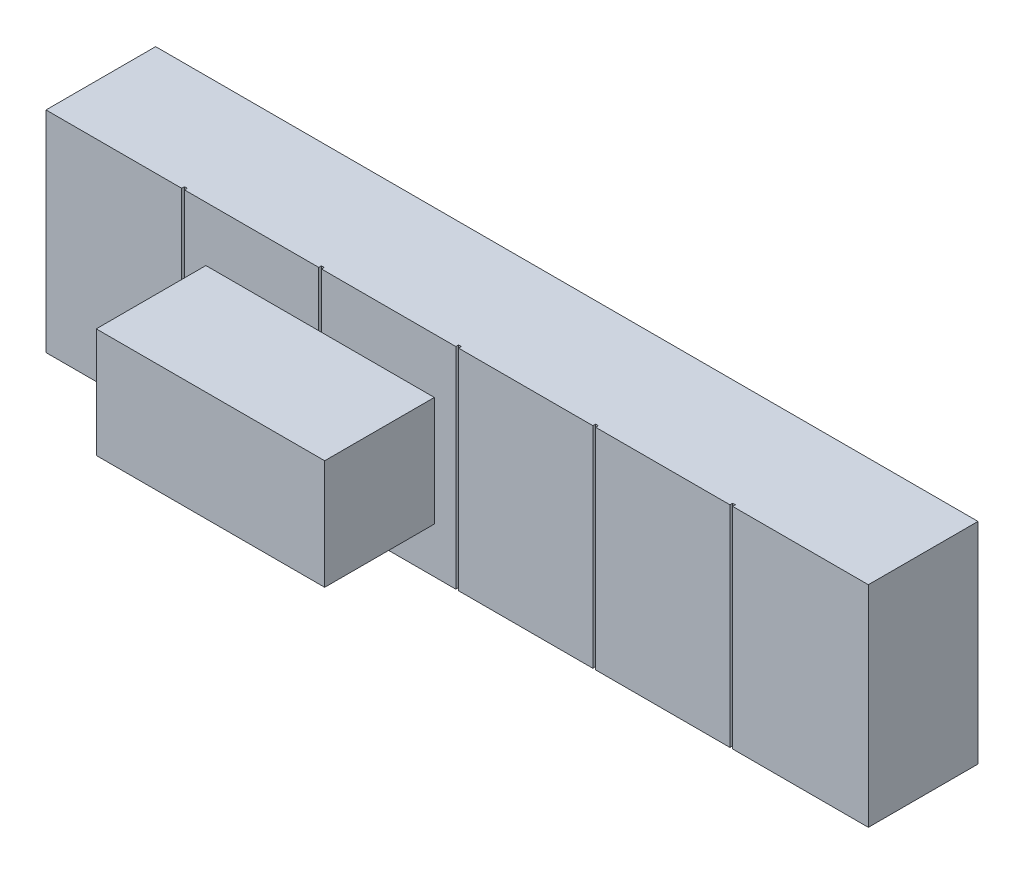
ISO-10303-21;
HEADER;
FILE_DESCRIPTION(('STEP AP214'),'2;1');
FILE_NAME('part.step','',(''),(''),'','','');
FILE_SCHEMA(('AUTOMOTIVE_DESIGN { 1 0 10303 214 1 1 1 1 }'));
ENDSEC;
DATA;
#1=APPLICATION_CONTEXT('core data for automotive mechanical design processes');
#2=APPLICATION_PROTOCOL_DEFINITION('international standard','automotive_design',2000,#1);
#3=PRODUCT_CONTEXT('',#1,'mechanical');
#4=PRODUCT('Part','Part','',(#3));
#5=PRODUCT_RELATED_PRODUCT_CATEGORY('part','',(#4));
#6=PRODUCT_DEFINITION_FORMATION('','',#4);
#7=PRODUCT_DEFINITION_CONTEXT('part definition',#1,'design');
#8=PRODUCT_DEFINITION('design','',#6,#7);
#9=PRODUCT_DEFINITION_SHAPE('','',#8);
#10=(LENGTH_UNIT() NAMED_UNIT(*) SI_UNIT(.MILLI.,.METRE.));
#11=(NAMED_UNIT(*) PLANE_ANGLE_UNIT() SI_UNIT($,.RADIAN.));
#12=(NAMED_UNIT(*) SI_UNIT($,.STERADIAN.) SOLID_ANGLE_UNIT());
#13=UNCERTAINTY_MEASURE_WITH_UNIT(LENGTH_MEASURE(1.E-05),#10,'distance_accuracy_value','');
#14=(GEOMETRIC_REPRESENTATION_CONTEXT(3) GLOBAL_UNCERTAINTY_ASSIGNED_CONTEXT((#13)) GLOBAL_UNIT_ASSIGNED_CONTEXT((#10,
#11,#12)) REPRESENTATION_CONTEXT('',''));
#15=CARTESIAN_POINT('',(0.,0.,0.));
#16=DIRECTION('',(0.,0.,1.));
#17=DIRECTION('',(1.,0.,0.));
#18=AXIS2_PLACEMENT_3D('',#15,#16,#17);
#19=CARTESIAN_POINT('',(0.,0.,120.));
#20=DIRECTION('',(0.,0.,-1.));
#21=DIRECTION('',(-1.,0.,0.));
#22=AXIS2_PLACEMENT_3D('',#19,#20,#21);
#23=PLANE('',#22);
#24=DIRECTION('',(-1.,0.,0.));
#25=VECTOR('',#24,1.);
#26=CARTESIAN_POINT('',(-275.,55.,120.));
#27=LINE('',#26,#25);
#28=CARTESIAN_POINT('',(-25.0000000000001,55.,120.));
#29=VERTEX_POINT('',#28);
#30=CARTESIAN_POINT('',(-148.5,55.,120.));
#31=VERTEX_POINT('',#30);
#32=EDGE_CURVE('E48',#29,#31,#27,.T.);
#33=ORIENTED_EDGE('',*,*,#32,.F.);
#34=DIRECTION('',(0.,1.,0.));
#35=VECTOR('',#34,1.);
#36=CARTESIAN_POINT('',(-25.0000000000001,-65.,120.));
#37=LINE('',#36,#35);
#38=CARTESIAN_POINT('',(-25.0000000000001,-65.,120.));
#39=VERTEX_POINT('',#38);
#40=EDGE_CURVE('E254',#39,#29,#37,.T.);
#41=ORIENTED_EDGE('',*,*,#40,.F.);
#42=DIRECTION('',(1.,0.,0.));
#43=VECTOR('',#42,1.);
#44=CARTESIAN_POINT('',(-275.,-65.,120.));
#45=LINE('',#44,#43);
#46=CARTESIAN_POINT('',(-148.5,-65.,120.));
#47=VERTEX_POINT('',#46);
#48=EDGE_CURVE('E497',#47,#39,#45,.T.);
#49=ORIENTED_EDGE('',*,*,#48,.F.);
#50=DIRECTION('',(0.,1.,0.));
#51=VECTOR('',#50,1.);
#52=CARTESIAN_POINT('',(-148.5,115.,120.));
#53=LINE('',#52,#51);
#54=CARTESIAN_POINT('',(-148.5,-115.,120.));
#55=VERTEX_POINT('',#54);
#56=EDGE_CURVE('E268',#55,#47,#53,.T.);
#57=ORIENTED_EDGE('',*,*,#56,.F.);
#58=DIRECTION('',(1.,0.,0.));
#59=VECTOR('',#58,1.);
#60=CARTESIAN_POINT('',(-450.,-115.,120.));
#61=LINE('',#60,#59);
#62=CARTESIAN_POINT('',(-1.50000000000011,-115.,120.));
#63=VERTEX_POINT('',#62);
#64=EDGE_CURVE('E459',#55,#63,#61,.T.);
#65=ORIENTED_EDGE('',*,*,#64,.T.);
#66=DIRECTION('',(0.,-1.,0.));
#67=VECTOR('',#66,1.);
#68=CARTESIAN_POINT('',(-1.50000000000017,115.,120.));
#69=LINE('',#68,#67);
#70=CARTESIAN_POINT('',(-1.50000000000011,115.,120.));
#71=VERTEX_POINT('',#70);
#72=EDGE_CURVE('E308',#71,#63,#69,.T.);
#73=ORIENTED_EDGE('',*,*,#72,.F.);
#74=DIRECTION('',(-1.,0.,0.));
#75=VECTOR('',#74,1.);
#76=CARTESIAN_POINT('',(-450.,115.,120.));
#77=LINE('',#76,#75);
#78=CARTESIAN_POINT('',(-148.5,115.,120.));
#79=VERTEX_POINT('',#78);
#80=EDGE_CURVE('E541',#71,#79,#77,.T.);
#81=ORIENTED_EDGE('',*,*,#80,.T.);
#82=EDGE_CURVE('E280',#31,#79,#53,.T.);
#83=ORIENTED_EDGE('',*,*,#82,.F.);
#84=EDGE_LOOP('',(#33,#41,#49,#57,#65,#73,#81,#83));
#85=FACE_BOUND('',#84,.T.);
#86=ADVANCED_FACE('F33',(#85),#23,.F.);
#87=CARTESIAN_POINT('',(-151.5,55.,120.));
#88=VERTEX_POINT('',#87);
#89=CARTESIAN_POINT('',(-275.,55.,120.));
#90=VERTEX_POINT('',#89);
#91=EDGE_CURVE('E491',#88,#90,#27,.T.);
#92=ORIENTED_EDGE('',*,*,#91,.F.);
#93=DIRECTION('',(0.,-1.,0.));
#94=VECTOR('',#93,1.);
#95=CARTESIAN_POINT('',(-151.5,115.,120.));
#96=LINE('',#95,#94);
#97=CARTESIAN_POINT('',(-151.5,115.,120.));
#98=VERTEX_POINT('',#97);
#99=EDGE_CURVE('E277',#98,#88,#96,.T.);
#100=ORIENTED_EDGE('',*,*,#99,.F.);
#101=CARTESIAN_POINT('',(-298.5,115.,120.));
#102=VERTEX_POINT('',#101);
#103=EDGE_CURVE('E406',#98,#102,#77,.T.);
#104=ORIENTED_EDGE('',*,*,#103,.T.);
#105=DIRECTION('',(0.,1.,0.));
#106=VECTOR('',#105,1.);
#107=CARTESIAN_POINT('',(-298.5,115.,120.));
#108=LINE('',#107,#106);
#109=CARTESIAN_POINT('',(-298.5,-115.,120.));
#110=VERTEX_POINT('',#109);
#111=EDGE_CURVE('E373',#110,#102,#108,.T.);
#112=ORIENTED_EDGE('',*,*,#111,.F.);
#113=CARTESIAN_POINT('',(-151.5,-115.,120.));
#114=VERTEX_POINT('',#113);
#115=EDGE_CURVE('E413',#110,#114,#61,.T.);
#116=ORIENTED_EDGE('',*,*,#115,.T.);
#117=CARTESIAN_POINT('',(-151.5,-65.,120.));
#118=VERTEX_POINT('',#117);
#119=EDGE_CURVE('E282',#118,#114,#96,.T.);
#120=ORIENTED_EDGE('',*,*,#119,.F.);
#121=CARTESIAN_POINT('',(-275.,-65.,120.));
#122=VERTEX_POINT('',#121);
#123=EDGE_CURVE('E56',#122,#118,#45,.T.);
#124=ORIENTED_EDGE('',*,*,#123,.F.);
#125=DIRECTION('',(0.,-1.,0.));
#126=VECTOR('',#125,1.);
#127=CARTESIAN_POINT('',(-275.,-65.,120.));
#128=LINE('',#127,#126);
#129=EDGE_CURVE('E492',#90,#122,#128,.T.);
#130=ORIENTED_EDGE('',*,*,#129,.F.);
#131=EDGE_LOOP('',(#92,#100,#104,#112,#116,#120,#124,#130));
#132=FACE_BOUND('',#131,.T.);
#133=ADVANCED_FACE('F474',(#132),#23,.F.);
#134=CARTESIAN_POINT('',(148.5,115.,120.));
#135=VERTEX_POINT('',#134);
#136=CARTESIAN_POINT('',(1.49999999999983,115.,120.));
#137=VERTEX_POINT('',#136);
#138=EDGE_CURVE('E543',#135,#137,#77,.T.);
#139=ORIENTED_EDGE('',*,*,#138,.T.);
#140=DIRECTION('',(0.,1.,0.));
#141=VECTOR('',#140,1.);
#142=CARTESIAN_POINT('',(1.49999999999983,115.,120.));
#143=LINE('',#142,#141);
#144=CARTESIAN_POINT('',(1.49999999999983,-115.,120.));
#145=VERTEX_POINT('',#144);
#146=EDGE_CURVE('E299',#145,#137,#143,.T.);
#147=ORIENTED_EDGE('',*,*,#146,.F.);
#148=CARTESIAN_POINT('',(148.5,-115.,120.));
#149=VERTEX_POINT('',#148);
#150=EDGE_CURVE('E453',#145,#149,#61,.T.);
#151=ORIENTED_EDGE('',*,*,#150,.T.);
#152=DIRECTION('',(0.,-1.,0.));
#153=VECTOR('',#152,1.);
#154=CARTESIAN_POINT('',(148.5,115.,120.));
#155=LINE('',#154,#153);
#156=EDGE_CURVE('E334',#135,#149,#155,.T.);
#157=ORIENTED_EDGE('',*,*,#156,.F.);
#158=EDGE_LOOP('',(#139,#147,#151,#157));
#159=FACE_BOUND('',#158,.T.);
#160=ADVANCED_FACE('F523',(#159),#23,.F.);
#161=CARTESIAN_POINT('',(298.5,115.,120.));
#162=VERTEX_POINT('',#161);
#163=CARTESIAN_POINT('',(151.5,115.,120.));
#164=VERTEX_POINT('',#163);
#165=EDGE_CURVE('E405',#162,#164,#77,.T.);
#166=ORIENTED_EDGE('',*,*,#165,.T.);
#167=DIRECTION('',(0.,1.,0.));
#168=VECTOR('',#167,1.);
#169=CARTESIAN_POINT('',(151.5,115.,120.));
#170=LINE('',#169,#168);
#171=CARTESIAN_POINT('',(151.5,-115.,120.));
#172=VERTEX_POINT('',#171);
#173=EDGE_CURVE('E325',#172,#164,#170,.T.);
#174=ORIENTED_EDGE('',*,*,#173,.F.);
#175=CARTESIAN_POINT('',(298.5,-115.,120.));
#176=VERTEX_POINT('',#175);
#177=EDGE_CURVE('E451',#172,#176,#61,.T.);
#178=ORIENTED_EDGE('',*,*,#177,.T.);
#179=DIRECTION('',(0.,-1.,0.));
#180=VECTOR('',#179,1.);
#181=CARTESIAN_POINT('',(298.5,115.,120.));
#182=LINE('',#181,#180);
#183=EDGE_CURVE('E258',#162,#176,#182,.T.);
#184=ORIENTED_EDGE('',*,*,#183,.F.);
#185=EDGE_LOOP('',(#166,#174,#178,#184));
#186=FACE_BOUND('',#185,.T.);
#187=ADVANCED_FACE('F533',(#186),#23,.F.);
#188=CARTESIAN_POINT('',(450.,115.,120.));
#189=VERTEX_POINT('',#188);
#190=CARTESIAN_POINT('',(301.5,115.,120.));
#191=VERTEX_POINT('',#190);
#192=EDGE_CURVE('E401',#189,#191,#77,.T.);
#193=ORIENTED_EDGE('',*,*,#192,.T.);
#194=DIRECTION('',(0.,1.,0.));
#195=VECTOR('',#194,1.);
#196=CARTESIAN_POINT('',(301.5,115.,120.));
#197=LINE('',#196,#195);
#198=CARTESIAN_POINT('',(301.5,-115.,120.));
#199=VERTEX_POINT('',#198);
#200=EDGE_CURVE('E350',#199,#191,#197,.T.);
#201=ORIENTED_EDGE('',*,*,#200,.F.);
#202=CARTESIAN_POINT('',(450.,-115.,120.));
#203=VERTEX_POINT('',#202);
#204=EDGE_CURVE('E408',#199,#203,#61,.T.);
#205=ORIENTED_EDGE('',*,*,#204,.T.);
#206=DIRECTION('',(0.,1.,0.));
#207=VECTOR('',#206,1.);
#208=CARTESIAN_POINT('',(450.,-115.,120.));
#209=LINE('',#208,#207);
#210=EDGE_CURVE('E396',#203,#189,#209,.T.);
#211=ORIENTED_EDGE('',*,*,#210,.T.);
#212=EDGE_LOOP('',(#193,#201,#205,#211));
#213=FACE_BOUND('',#212,.T.);
#214=ADVANCED_FACE('F448',(#213),#23,.F.);
#215=CARTESIAN_POINT('',(-450.,-115.,120.));
#216=VERTEX_POINT('',#215);
#217=CARTESIAN_POINT('',(-301.5,-115.,120.));
#218=VERTEX_POINT('',#217);
#219=EDGE_CURVE('E409',#216,#218,#61,.T.);
#220=ORIENTED_EDGE('',*,*,#219,.T.);
#221=DIRECTION('',(0.,-1.,0.));
#222=VECTOR('',#221,1.);
#223=CARTESIAN_POINT('',(-301.5,115.,120.));
#224=LINE('',#223,#222);
#225=CARTESIAN_POINT('',(-301.5,115.,120.));
#226=VERTEX_POINT('',#225);
#227=EDGE_CURVE('E288',#226,#218,#224,.T.);
#228=ORIENTED_EDGE('',*,*,#227,.F.);
#229=CARTESIAN_POINT('',(-450.,115.,120.));
#230=VERTEX_POINT('',#229);
#231=EDGE_CURVE('E399',#226,#230,#77,.T.);
#232=ORIENTED_EDGE('',*,*,#231,.T.);
#233=DIRECTION('',(0.,-1.,0.));
#234=VECTOR('',#233,1.);
#235=CARTESIAN_POINT('',(-450.,-115.,120.));
#236=LINE('',#235,#234);
#237=EDGE_CURVE('E404',#230,#216,#236,.T.);
#238=ORIENTED_EDGE('',*,*,#237,.T.);
#239=EDGE_LOOP('',(#220,#228,#232,#238));
#240=FACE_BOUND('',#239,.T.);
#241=ADVANCED_FACE('F518',(#240),#23,.F.);
#242=CARTESIAN_POINT('',(450.,-115.,120.));
#243=DIRECTION('',(-1.,0.,0.));
#244=DIRECTION('',(0.,0.,1.));
#245=AXIS2_PLACEMENT_3D('',#242,#243,#244);
#246=PLANE('',#245);
#247=DIRECTION('',(0.,1.,0.));
#248=VECTOR('',#247,1.);
#249=CARTESIAN_POINT('',(450.,-115.,0.));
#250=LINE('',#249,#248);
#251=CARTESIAN_POINT('',(450.,-115.,0.));
#252=VERTEX_POINT('',#251);
#253=CARTESIAN_POINT('',(450.,115.,0.));
#254=VERTEX_POINT('',#253);
#255=EDGE_CURVE('E388',#252,#254,#250,.T.);
#256=ORIENTED_EDGE('',*,*,#255,.T.);
#257=DIRECTION('',(0.,0.,-1.));
#258=VECTOR('',#257,1.);
#259=CARTESIAN_POINT('',(450.,115.,120.));
#260=LINE('',#259,#258);
#261=EDGE_CURVE('E11',#189,#254,#260,.T.);
#262=ORIENTED_EDGE('',*,*,#261,.F.);
#263=ORIENTED_EDGE('',*,*,#210,.F.);
#264=DIRECTION('',(0.,0.,-1.));
#265=VECTOR('',#264,1.);
#266=CARTESIAN_POINT('',(450.,-115.,120.));
#267=LINE('',#266,#265);
#268=EDGE_CURVE('E412',#203,#252,#267,.T.);
#269=ORIENTED_EDGE('',*,*,#268,.T.);
#270=EDGE_LOOP('',(#256,#262,#263,#269));
#271=FACE_BOUND('',#270,.T.);
#272=ADVANCED_FACE('F35',(#271),#246,.F.);
#273=CARTESIAN_POINT('',(-450.,115.,120.));
#274=DIRECTION('',(0.,-1.,0.));
#275=DIRECTION('',(0.,0.,-1.));
#276=AXIS2_PLACEMENT_3D('',#273,#274,#275);
#277=PLANE('',#276);
#278=DIRECTION('',(-1.,0.,0.));
#279=VECTOR('',#278,1.);
#280=CARTESIAN_POINT('',(-151.5,115.,117.));
#281=LINE('',#280,#279);
#282=CARTESIAN_POINT('',(-148.5,115.,117.));
#283=VERTEX_POINT('',#282);
#284=CARTESIAN_POINT('',(-151.5,115.,117.));
#285=VERTEX_POINT('',#284);
#286=EDGE_CURVE('E264',#283,#285,#281,.T.);
#287=ORIENTED_EDGE('',*,*,#286,.F.);
#288=DIRECTION('',(0.,0.,1.));
#289=VECTOR('',#288,1.);
#290=CARTESIAN_POINT('',(-148.5,115.,117.));
#291=LINE('',#290,#289);
#292=EDGE_CURVE('E285',#283,#79,#291,.T.);
#293=ORIENTED_EDGE('',*,*,#292,.T.);
#294=ORIENTED_EDGE('',*,*,#80,.F.);
#295=DIRECTION('',(0.,0.,1.));
#296=VECTOR('',#295,1.);
#297=CARTESIAN_POINT('',(-1.50000000000017,115.,117.));
#298=LINE('',#297,#296);
#299=CARTESIAN_POINT('',(-1.50000000000017,115.,117.));
#300=VERTEX_POINT('',#299);
#301=EDGE_CURVE('E307',#300,#71,#298,.T.);
#302=ORIENTED_EDGE('',*,*,#301,.F.);
#303=DIRECTION('',(-1.,0.,0.));
#304=VECTOR('',#303,1.);
#305=CARTESIAN_POINT('',(-1.50000000000017,115.,117.));
#306=LINE('',#305,#304);
#307=CARTESIAN_POINT('',(1.49999999999983,115.,117.));
#308=VERTEX_POINT('',#307);
#309=EDGE_CURVE('E295',#308,#300,#306,.T.);
#310=ORIENTED_EDGE('',*,*,#309,.F.);
#311=DIRECTION('',(0.,0.,1.));
#312=VECTOR('',#311,1.);
#313=CARTESIAN_POINT('',(1.49999999999983,115.,117.));
#314=LINE('',#313,#312);
#315=EDGE_CURVE('E312',#308,#137,#314,.T.);
#316=ORIENTED_EDGE('',*,*,#315,.T.);
#317=ORIENTED_EDGE('',*,*,#138,.F.);
#318=DIRECTION('',(0.,0.,1.));
#319=VECTOR('',#318,1.);
#320=CARTESIAN_POINT('',(148.5,115.,117.));
#321=LINE('',#320,#319);
#322=CARTESIAN_POINT('',(148.5,115.,117.));
#323=VERTEX_POINT('',#322);
#324=EDGE_CURVE('E333',#323,#135,#321,.T.);
#325=ORIENTED_EDGE('',*,*,#324,.F.);
#326=DIRECTION('',(-1.,0.,0.));
#327=VECTOR('',#326,1.);
#328=CARTESIAN_POINT('',(148.5,115.,117.));
#329=LINE('',#328,#327);
#330=CARTESIAN_POINT('',(151.5,115.,117.));
#331=VERTEX_POINT('',#330);
#332=EDGE_CURVE('E321',#331,#323,#329,.T.);
#333=ORIENTED_EDGE('',*,*,#332,.F.);
#334=DIRECTION('',(0.,0.,1.));
#335=VECTOR('',#334,1.);
#336=CARTESIAN_POINT('',(151.5,115.,117.));
#337=LINE('',#336,#335);
#338=EDGE_CURVE('E310',#331,#164,#337,.T.);
#339=ORIENTED_EDGE('',*,*,#338,.T.);
#340=ORIENTED_EDGE('',*,*,#165,.F.);
#341=DIRECTION('',(0.,0.,1.));
#342=VECTOR('',#341,1.);
#343=CARTESIAN_POINT('',(298.5,115.,117.));
#344=LINE('',#343,#342);
#345=CARTESIAN_POINT('',(298.5,115.,117.));
#346=VERTEX_POINT('',#345);
#347=EDGE_CURVE('E358',#346,#162,#344,.T.);
#348=ORIENTED_EDGE('',*,*,#347,.F.);
#349=DIRECTION('',(-1.,0.,0.));
#350=VECTOR('',#349,1.);
#351=CARTESIAN_POINT('',(298.5,115.,117.));
#352=LINE('',#351,#350);
#353=CARTESIAN_POINT('',(301.5,115.,117.));
#354=VERTEX_POINT('',#353);
#355=EDGE_CURVE('E346',#354,#346,#352,.T.);
#356=ORIENTED_EDGE('',*,*,#355,.F.);
#357=DIRECTION('',(0.,0.,1.));
#358=VECTOR('',#357,1.);
#359=CARTESIAN_POINT('',(301.5,115.,117.));
#360=LINE('',#359,#358);
#361=EDGE_CURVE('E336',#354,#191,#360,.T.);
#362=ORIENTED_EDGE('',*,*,#361,.T.);
#363=ORIENTED_EDGE('',*,*,#192,.F.);
#364=ORIENTED_EDGE('',*,*,#261,.T.);
#365=DIRECTION('',(-1.,0.,0.));
#366=VECTOR('',#365,1.);
#367=CARTESIAN_POINT('',(-450.,115.,0.));
#368=LINE('',#367,#366);
#369=CARTESIAN_POINT('',(-450.,115.,0.));
#370=VERTEX_POINT('',#369);
#371=EDGE_CURVE('E416',#254,#370,#368,.T.);
#372=ORIENTED_EDGE('',*,*,#371,.T.);
#373=DIRECTION('',(0.,0.,-1.));
#374=VECTOR('',#373,1.);
#375=CARTESIAN_POINT('',(-450.,115.,120.));
#376=LINE('',#375,#374);
#377=EDGE_CURVE('E41',#230,#370,#376,.T.);
#378=ORIENTED_EDGE('',*,*,#377,.F.);
#379=ORIENTED_EDGE('',*,*,#231,.F.);
#380=DIRECTION('',(0.,0.,1.));
#381=VECTOR('',#380,1.);
#382=CARTESIAN_POINT('',(-301.5,115.,117.));
#383=LINE('',#382,#381);
#384=CARTESIAN_POINT('',(-301.5,115.,117.));
#385=VERTEX_POINT('',#384);
#386=EDGE_CURVE('E386',#385,#226,#383,.T.);
#387=ORIENTED_EDGE('',*,*,#386,.F.);
#388=DIRECTION('',(-1.,0.,0.));
#389=VECTOR('',#388,1.);
#390=CARTESIAN_POINT('',(-301.5,115.,117.));
#391=LINE('',#390,#389);
#392=CARTESIAN_POINT('',(-298.5,115.,117.));
#393=VERTEX_POINT('',#392);
#394=EDGE_CURVE('E379',#393,#385,#391,.T.);
#395=ORIENTED_EDGE('',*,*,#394,.F.);
#396=DIRECTION('',(0.,0.,1.));
#397=VECTOR('',#396,1.);
#398=CARTESIAN_POINT('',(-298.5,115.,117.));
#399=LINE('',#398,#397);
#400=EDGE_CURVE('E389',#393,#102,#399,.T.);
#401=ORIENTED_EDGE('',*,*,#400,.T.);
#402=ORIENTED_EDGE('',*,*,#103,.F.);
#403=DIRECTION('',(0.,0.,1.));
#404=VECTOR('',#403,1.);
#405=CARTESIAN_POINT('',(-151.5,115.,117.));
#406=LINE('',#405,#404);
#407=EDGE_CURVE('E276',#285,#98,#406,.T.);
#408=ORIENTED_EDGE('',*,*,#407,.F.);
#409=EDGE_LOOP('',(#287,#293,#294,#302,#310,#316,#317,#325,#333,#339,#340,#348,#356,#362,#363,
#364,#372,#378,#379,#387,#395,#401,#402,#408));
#410=FACE_BOUND('',#409,.T.);
#411=ADVANCED_FACE('F488',(#410),#277,.F.);
#412=CARTESIAN_POINT('',(-450.,-115.,120.));
#413=DIRECTION('',(1.,0.,0.));
#414=DIRECTION('',(0.,0.,-1.));
#415=AXIS2_PLACEMENT_3D('',#412,#413,#414);
#416=PLANE('',#415);
#417=DIRECTION('',(0.,-1.,0.));
#418=VECTOR('',#417,1.);
#419=CARTESIAN_POINT('',(-450.,-115.,0.));
#420=LINE('',#419,#418);
#421=CARTESIAN_POINT('',(-450.,-115.,0.));
#422=VERTEX_POINT('',#421);
#423=EDGE_CURVE('E418',#370,#422,#420,.T.);
#424=ORIENTED_EDGE('',*,*,#423,.T.);
#425=DIRECTION('',(0.,0.,-1.));
#426=VECTOR('',#425,1.);
#427=CARTESIAN_POINT('',(-450.,-115.,120.));
#428=LINE('',#427,#426);
#429=EDGE_CURVE('E423',#216,#422,#428,.T.);
#430=ORIENTED_EDGE('',*,*,#429,.F.);
#431=ORIENTED_EDGE('',*,*,#237,.F.);
#432=ORIENTED_EDGE('',*,*,#377,.T.);
#433=EDGE_LOOP('',(#424,#430,#431,#432));
#434=FACE_BOUND('',#433,.T.);
#435=ADVANCED_FACE('F430',(#434),#416,.F.);
#436=CARTESIAN_POINT('',(-450.,-115.,120.));
#437=DIRECTION('',(0.,1.,0.));
#438=DIRECTION('',(0.,0.,1.));
#439=AXIS2_PLACEMENT_3D('',#436,#437,#438);
#440=PLANE('',#439);
#441=ORIENTED_EDGE('',*,*,#64,.F.);
#442=DIRECTION('',(0.,0.,1.));
#443=VECTOR('',#442,1.);
#444=CARTESIAN_POINT('',(-148.5,-115.,117.));
#445=LINE('',#444,#443);
#446=CARTESIAN_POINT('',(-148.5,-115.,117.));
#447=VERTEX_POINT('',#446);
#448=EDGE_CURVE('E289',#447,#55,#445,.T.);
#449=ORIENTED_EDGE('',*,*,#448,.F.);
#450=DIRECTION('',(1.,0.,0.));
#451=VECTOR('',#450,1.);
#452=CARTESIAN_POINT('',(-151.5,-115.,117.));
#453=LINE('',#452,#451);
#454=CARTESIAN_POINT('',(-151.5,-115.,117.));
#455=VERTEX_POINT('',#454);
#456=EDGE_CURVE('E271',#455,#447,#453,.T.);
#457=ORIENTED_EDGE('',*,*,#456,.F.);
#458=DIRECTION('',(0.,0.,1.));
#459=VECTOR('',#458,1.);
#460=CARTESIAN_POINT('',(-151.5,-115.,117.));
#461=LINE('',#460,#459);
#462=EDGE_CURVE('E291',#455,#114,#461,.T.);
#463=ORIENTED_EDGE('',*,*,#462,.T.);
#464=ORIENTED_EDGE('',*,*,#115,.F.);
#465=DIRECTION('',(0.,0.,1.));
#466=VECTOR('',#465,1.);
#467=CARTESIAN_POINT('',(-298.5,-115.,117.));
#468=LINE('',#467,#466);
#469=CARTESIAN_POINT('',(-298.5,-115.,117.));
#470=VERTEX_POINT('',#469);
#471=EDGE_CURVE('E392',#470,#110,#468,.T.);
#472=ORIENTED_EDGE('',*,*,#471,.F.);
#473=DIRECTION('',(1.,0.,0.));
#474=VECTOR('',#473,1.);
#475=CARTESIAN_POINT('',(-301.5,-115.,117.));
#476=LINE('',#475,#474);
#477=CARTESIAN_POINT('',(-301.5,-115.,117.));
#478=VERTEX_POINT('',#477);
#479=EDGE_CURVE('E372',#478,#470,#476,.T.);
#480=ORIENTED_EDGE('',*,*,#479,.F.);
#481=DIRECTION('',(0.,0.,1.));
#482=VECTOR('',#481,1.);
#483=CARTESIAN_POINT('',(-301.5,-115.,117.));
#484=LINE('',#483,#482);
#485=EDGE_CURVE('E382',#478,#218,#484,.T.);
#486=ORIENTED_EDGE('',*,*,#485,.T.);
#487=ORIENTED_EDGE('',*,*,#219,.F.);
#488=ORIENTED_EDGE('',*,*,#429,.T.);
#489=DIRECTION('',(1.,0.,0.));
#490=VECTOR('',#489,1.);
#491=CARTESIAN_POINT('',(-450.,-115.,0.));
#492=LINE('',#491,#490);
#493=EDGE_CURVE('E400',#422,#252,#492,.T.);
#494=ORIENTED_EDGE('',*,*,#493,.T.);
#495=ORIENTED_EDGE('',*,*,#268,.F.);
#496=ORIENTED_EDGE('',*,*,#204,.F.);
#497=DIRECTION('',(0.,0.,1.));
#498=VECTOR('',#497,1.);
#499=CARTESIAN_POINT('',(301.5,-115.,117.));
#500=LINE('',#499,#498);
#501=CARTESIAN_POINT('',(301.5,-115.,117.));
#502=VERTEX_POINT('',#501);
#503=EDGE_CURVE('E363',#502,#199,#500,.T.);
#504=ORIENTED_EDGE('',*,*,#503,.F.);
#505=DIRECTION('',(1.,0.,0.));
#506=VECTOR('',#505,1.);
#507=CARTESIAN_POINT('',(298.5,-115.,117.));
#508=LINE('',#507,#506);
#509=CARTESIAN_POINT('',(298.5,-115.,117.));
#510=VERTEX_POINT('',#509);
#511=EDGE_CURVE('E353',#510,#502,#508,.T.);
#512=ORIENTED_EDGE('',*,*,#511,.F.);
#513=DIRECTION('',(0.,0.,1.));
#514=VECTOR('',#513,1.);
#515=CARTESIAN_POINT('',(298.5,-115.,117.));
#516=LINE('',#515,#514);
#517=EDGE_CURVE('E365',#510,#176,#516,.T.);
#518=ORIENTED_EDGE('',*,*,#517,.T.);
#519=ORIENTED_EDGE('',*,*,#177,.F.);
#520=DIRECTION('',(0.,0.,1.));
#521=VECTOR('',#520,1.);
#522=CARTESIAN_POINT('',(151.5,-115.,117.));
#523=LINE('',#522,#521);
#524=CARTESIAN_POINT('',(151.5,-115.,117.));
#525=VERTEX_POINT('',#524);
#526=EDGE_CURVE('E340',#525,#172,#523,.T.);
#527=ORIENTED_EDGE('',*,*,#526,.F.);
#528=DIRECTION('',(1.,0.,0.));
#529=VECTOR('',#528,1.);
#530=CARTESIAN_POINT('',(148.5,-115.,117.));
#531=LINE('',#530,#529);
#532=CARTESIAN_POINT('',(148.5,-115.,117.));
#533=VERTEX_POINT('',#532);
#534=EDGE_CURVE('E328',#533,#525,#531,.T.);
#535=ORIENTED_EDGE('',*,*,#534,.F.);
#536=DIRECTION('',(0.,0.,1.));
#537=VECTOR('',#536,1.);
#538=CARTESIAN_POINT('',(148.5,-115.,117.));
#539=LINE('',#538,#537);
#540=EDGE_CURVE('E342',#533,#149,#539,.T.);
#541=ORIENTED_EDGE('',*,*,#540,.T.);
#542=ORIENTED_EDGE('',*,*,#150,.F.);
#543=DIRECTION('',(0.,0.,1.));
#544=VECTOR('',#543,1.);
#545=CARTESIAN_POINT('',(1.49999999999983,-115.,117.));
#546=LINE('',#545,#544);
#547=CARTESIAN_POINT('',(1.49999999999983,-115.,117.));
#548=VERTEX_POINT('',#547);
#549=EDGE_CURVE('E315',#548,#145,#546,.T.);
#550=ORIENTED_EDGE('',*,*,#549,.F.);
#551=DIRECTION('',(1.,0.,0.));
#552=VECTOR('',#551,1.);
#553=CARTESIAN_POINT('',(-1.50000000000011,-115.,117.));
#554=LINE('',#553,#552);
#555=CARTESIAN_POINT('',(-1.50000000000011,-115.,117.));
#556=VERTEX_POINT('',#555);
#557=EDGE_CURVE('E302',#556,#548,#554,.T.);
#558=ORIENTED_EDGE('',*,*,#557,.F.);
#559=DIRECTION('',(0.,0.,1.));
#560=VECTOR('',#559,1.);
#561=CARTESIAN_POINT('',(-1.50000000000011,-115.,117.));
#562=LINE('',#561,#560);
#563=EDGE_CURVE('E317',#556,#63,#562,.T.);
#564=ORIENTED_EDGE('',*,*,#563,.T.);
#565=EDGE_LOOP('',(#441,#449,#457,#463,#464,#472,#480,#486,#487,#488,#494,#495,#496,#504,#512,
#518,#519,#527,#535,#541,#542,#550,#558,#564));
#566=FACE_BOUND('',#565,.T.);
#567=ADVANCED_FACE('F441',(#566),#440,.F.);
#568=CARTESIAN_POINT('',(0.,0.,0.));
#569=DIRECTION('',(0.,0.,-1.));
#570=DIRECTION('',(-1.,0.,0.));
#571=AXIS2_PLACEMENT_3D('',#568,#569,#570);
#572=PLANE('',#571);
#573=ORIENTED_EDGE('',*,*,#255,.F.);
#574=ORIENTED_EDGE('',*,*,#493,.F.);
#575=ORIENTED_EDGE('',*,*,#423,.F.);
#576=ORIENTED_EDGE('',*,*,#371,.F.);
#577=EDGE_LOOP('',(#573,#574,#575,#576));
#578=FACE_BOUND('',#577,.T.);
#579=ADVANCED_FACE('F437',(#578),#572,.T.);
#580=CARTESIAN_POINT('',(-301.5,115.,117.));
#581=DIRECTION('',(-1.,0.,0.));
#582=DIRECTION('',(0.,-1.,0.));
#583=AXIS2_PLACEMENT_3D('',#580,#581,#582);
#584=PLANE('',#583);
#585=ORIENTED_EDGE('',*,*,#227,.T.);
#586=ORIENTED_EDGE('',*,*,#485,.F.);
#587=DIRECTION('',(0.,-1.,0.));
#588=VECTOR('',#587,1.);
#589=CARTESIAN_POINT('',(-301.5,115.,117.));
#590=LINE('',#589,#588);
#591=EDGE_CURVE('E369',#385,#478,#590,.T.);
#592=ORIENTED_EDGE('',*,*,#591,.F.);
#593=ORIENTED_EDGE('',*,*,#386,.T.);
#594=EDGE_LOOP('',(#585,#586,#592,#593));
#595=FACE_BOUND('',#594,.T.);
#596=ADVANCED_FACE('F536',(#595),#584,.F.);
#597=CARTESIAN_POINT('',(-298.5,115.,117.));
#598=DIRECTION('',(1.,0.,0.));
#599=DIRECTION('',(0.,0.,-1.));
#600=AXIS2_PLACEMENT_3D('',#597,#598,#599);
#601=PLANE('',#600);
#602=ORIENTED_EDGE('',*,*,#111,.T.);
#603=ORIENTED_EDGE('',*,*,#400,.F.);
#604=DIRECTION('',(0.,1.,0.));
#605=VECTOR('',#604,1.);
#606=CARTESIAN_POINT('',(-298.5,115.,117.));
#607=LINE('',#606,#605);
#608=EDGE_CURVE('E376',#470,#393,#607,.T.);
#609=ORIENTED_EDGE('',*,*,#608,.F.);
#610=ORIENTED_EDGE('',*,*,#471,.T.);
#611=EDGE_LOOP('',(#602,#603,#609,#610));
#612=FACE_BOUND('',#611,.T.);
#613=ADVANCED_FACE('F594',(#612),#601,.F.);
#614=CARTESIAN_POINT('',(0.,0.,117.));
#615=DIRECTION('',(0.,0.,1.));
#616=DIRECTION('',(1.,0.,0.));
#617=AXIS2_PLACEMENT_3D('',#614,#615,#616);
#618=PLANE('',#617);
#619=ORIENTED_EDGE('',*,*,#591,.T.);
#620=ORIENTED_EDGE('',*,*,#479,.T.);
#621=ORIENTED_EDGE('',*,*,#608,.T.);
#622=ORIENTED_EDGE('',*,*,#394,.T.);
#623=EDGE_LOOP('',(#619,#620,#621,#622));
#624=FACE_BOUND('',#623,.T.);
#625=ADVANCED_FACE('F538',(#624),#618,.T.);
#626=CARTESIAN_POINT('',(301.5,115.,117.));
#627=DIRECTION('',(1.,0.,0.));
#628=DIRECTION('',(0.,0.,-1.));
#629=AXIS2_PLACEMENT_3D('',#626,#627,#628);
#630=PLANE('',#629);
#631=ORIENTED_EDGE('',*,*,#200,.T.);
#632=ORIENTED_EDGE('',*,*,#361,.F.);
#633=DIRECTION('',(0.,1.,0.));
#634=VECTOR('',#633,1.);
#635=CARTESIAN_POINT('',(301.5,115.,117.));
#636=LINE('',#635,#634);
#637=EDGE_CURVE('E355',#502,#354,#636,.T.);
#638=ORIENTED_EDGE('',*,*,#637,.F.);
#639=ORIENTED_EDGE('',*,*,#503,.T.);
#640=EDGE_LOOP('',(#631,#632,#638,#639));
#641=FACE_BOUND('',#640,.T.);
#642=ADVANCED_FACE('F586',(#641),#630,.F.);
#643=CARTESIAN_POINT('',(298.5,115.,117.));
#644=DIRECTION('',(-1.,0.,0.));
#645=DIRECTION('',(0.,-1.,0.));
#646=AXIS2_PLACEMENT_3D('',#643,#644,#645);
#647=PLANE('',#646);
#648=ORIENTED_EDGE('',*,*,#183,.T.);
#649=ORIENTED_EDGE('',*,*,#517,.F.);
#650=DIRECTION('',(0.,-1.,0.));
#651=VECTOR('',#650,1.);
#652=CARTESIAN_POINT('',(298.5,115.,117.));
#653=LINE('',#652,#651);
#654=EDGE_CURVE('E349',#346,#510,#653,.T.);
#655=ORIENTED_EDGE('',*,*,#654,.F.);
#656=ORIENTED_EDGE('',*,*,#347,.T.);
#657=EDGE_LOOP('',(#648,#649,#655,#656));
#658=FACE_BOUND('',#657,.T.);
#659=ADVANCED_FACE('F580',(#658),#647,.F.);
#660=CARTESIAN_POINT('',(0.,0.,117.));
#661=DIRECTION('',(0.,0.,-1.));
#662=DIRECTION('',(-1.,0.,0.));
#663=AXIS2_PLACEMENT_3D('',#660,#661,#662);
#664=PLANE('',#663);
#665=ORIENTED_EDGE('',*,*,#355,.T.);
#666=ORIENTED_EDGE('',*,*,#654,.T.);
#667=ORIENTED_EDGE('',*,*,#511,.T.);
#668=ORIENTED_EDGE('',*,*,#637,.T.);
#669=EDGE_LOOP('',(#665,#666,#667,#668));
#670=FACE_BOUND('',#669,.T.);
#671=ADVANCED_FACE('F582',(#670),#664,.F.);
#672=CARTESIAN_POINT('',(151.5,115.,117.));
#673=DIRECTION('',(1.,0.,0.));
#674=DIRECTION('',(0.,0.,-1.));
#675=AXIS2_PLACEMENT_3D('',#672,#673,#674);
#676=PLANE('',#675);
#677=ORIENTED_EDGE('',*,*,#173,.T.);
#678=ORIENTED_EDGE('',*,*,#338,.F.);
#679=DIRECTION('',(0.,1.,0.));
#680=VECTOR('',#679,1.);
#681=CARTESIAN_POINT('',(151.5,115.,117.));
#682=LINE('',#681,#680);
#683=EDGE_CURVE('E330',#525,#331,#682,.T.);
#684=ORIENTED_EDGE('',*,*,#683,.F.);
#685=ORIENTED_EDGE('',*,*,#526,.T.);
#686=EDGE_LOOP('',(#677,#678,#684,#685));
#687=FACE_BOUND('',#686,.T.);
#688=ADVANCED_FACE('F577',(#687),#676,.F.);
#689=CARTESIAN_POINT('',(148.5,115.,117.));
#690=DIRECTION('',(-1.,0.,0.));
#691=DIRECTION('',(0.,-1.,0.));
#692=AXIS2_PLACEMENT_3D('',#689,#690,#691);
#693=PLANE('',#692);
#694=ORIENTED_EDGE('',*,*,#156,.T.);
#695=ORIENTED_EDGE('',*,*,#540,.F.);
#696=DIRECTION('',(0.,-1.,0.));
#697=VECTOR('',#696,1.);
#698=CARTESIAN_POINT('',(148.5,115.,117.));
#699=LINE('',#698,#697);
#700=EDGE_CURVE('E324',#323,#533,#699,.T.);
#701=ORIENTED_EDGE('',*,*,#700,.F.);
#702=ORIENTED_EDGE('',*,*,#324,.T.);
#703=EDGE_LOOP('',(#694,#695,#701,#702));
#704=FACE_BOUND('',#703,.T.);
#705=ADVANCED_FACE('F570',(#704),#693,.F.);
#706=CARTESIAN_POINT('',(0.,0.,117.));
#707=DIRECTION('',(0.,0.,-1.));
#708=DIRECTION('',(-1.,0.,0.));
#709=AXIS2_PLACEMENT_3D('',#706,#707,#708);
#710=PLANE('',#709);
#711=ORIENTED_EDGE('',*,*,#332,.T.);
#712=ORIENTED_EDGE('',*,*,#700,.T.);
#713=ORIENTED_EDGE('',*,*,#534,.T.);
#714=ORIENTED_EDGE('',*,*,#683,.T.);
#715=EDGE_LOOP('',(#711,#712,#713,#714));
#716=FACE_BOUND('',#715,.T.);
#717=ADVANCED_FACE('F572',(#716),#710,.F.);
#718=CARTESIAN_POINT('',(1.49999999999983,115.,117.));
#719=DIRECTION('',(1.,0.,0.));
#720=DIRECTION('',(0.,0.,-1.));
#721=AXIS2_PLACEMENT_3D('',#718,#719,#720);
#722=PLANE('',#721);
#723=ORIENTED_EDGE('',*,*,#146,.T.);
#724=ORIENTED_EDGE('',*,*,#315,.F.);
#725=DIRECTION('',(0.,1.,0.));
#726=VECTOR('',#725,1.);
#727=CARTESIAN_POINT('',(1.49999999999983,115.,117.));
#728=LINE('',#727,#726);
#729=EDGE_CURVE('E304',#548,#308,#728,.T.);
#730=ORIENTED_EDGE('',*,*,#729,.F.);
#731=ORIENTED_EDGE('',*,*,#549,.T.);
#732=EDGE_LOOP('',(#723,#724,#730,#731));
#733=FACE_BOUND('',#732,.T.);
#734=ADVANCED_FACE('F566',(#733),#722,.F.);
#735=CARTESIAN_POINT('',(-1.50000000000017,115.,117.));
#736=DIRECTION('',(-1.,0.,0.));
#737=DIRECTION('',(0.,-1.,0.));
#738=AXIS2_PLACEMENT_3D('',#735,#736,#737);
#739=PLANE('',#738);
#740=ORIENTED_EDGE('',*,*,#72,.T.);
#741=ORIENTED_EDGE('',*,*,#563,.F.);
#742=DIRECTION('',(0.,-1.,0.));
#743=VECTOR('',#742,1.);
#744=CARTESIAN_POINT('',(-1.50000000000017,115.,117.));
#745=LINE('',#744,#743);
#746=EDGE_CURVE('E298',#300,#556,#745,.T.);
#747=ORIENTED_EDGE('',*,*,#746,.F.);
#748=ORIENTED_EDGE('',*,*,#301,.T.);
#749=EDGE_LOOP('',(#740,#741,#747,#748));
#750=FACE_BOUND('',#749,.T.);
#751=ADVANCED_FACE('F560',(#750),#739,.F.);
#752=CARTESIAN_POINT('',(0.,0.,117.));
#753=DIRECTION('',(0.,0.,-1.));
#754=DIRECTION('',(-1.,0.,0.));
#755=AXIS2_PLACEMENT_3D('',#752,#753,#754);
#756=PLANE('',#755);
#757=ORIENTED_EDGE('',*,*,#309,.T.);
#758=ORIENTED_EDGE('',*,*,#746,.T.);
#759=ORIENTED_EDGE('',*,*,#557,.T.);
#760=ORIENTED_EDGE('',*,*,#729,.T.);
#761=EDGE_LOOP('',(#757,#758,#759,#760));
#762=FACE_BOUND('',#761,.T.);
#763=ADVANCED_FACE('F562',(#762),#756,.F.);
#764=CARTESIAN_POINT('',(-148.5,115.,117.));
#765=DIRECTION('',(1.,0.,0.));
#766=DIRECTION('',(0.,0.,-1.));
#767=AXIS2_PLACEMENT_3D('',#764,#765,#766);
#768=PLANE('',#767);
#769=ORIENTED_EDGE('',*,*,#56,.T.);
#770=DIRECTION('',(0.,1.,0.));
#771=VECTOR('',#770,1.);
#772=CARTESIAN_POINT('',(-148.5,115.,120.));
#773=LINE('',#772,#771);
#774=EDGE_CURVE('E255',#47,#31,#773,.T.);
#775=ORIENTED_EDGE('',*,*,#774,.T.);
#776=ORIENTED_EDGE('',*,*,#82,.T.);
#777=ORIENTED_EDGE('',*,*,#292,.F.);
#778=DIRECTION('',(0.,1.,0.));
#779=VECTOR('',#778,1.);
#780=CARTESIAN_POINT('',(-148.5,115.,117.));
#781=LINE('',#780,#779);
#782=EDGE_CURVE('E273',#447,#283,#781,.T.);
#783=ORIENTED_EDGE('',*,*,#782,.F.);
#784=ORIENTED_EDGE('',*,*,#448,.T.);
#785=EDGE_LOOP('',(#769,#775,#776,#777,#783,#784));
#786=FACE_BOUND('',#785,.T.);
#787=ADVANCED_FACE('F553',(#786),#768,.F.);
#788=CARTESIAN_POINT('',(-151.5,115.,117.));
#789=DIRECTION('',(-1.,0.,0.));
#790=DIRECTION('',(0.,-1.,0.));
#791=AXIS2_PLACEMENT_3D('',#788,#789,#790);
#792=PLANE('',#791);
#793=ORIENTED_EDGE('',*,*,#99,.T.);
#794=EDGE_CURVE('E281',#88,#118,#96,.T.);
#795=ORIENTED_EDGE('',*,*,#794,.T.);
#796=ORIENTED_EDGE('',*,*,#119,.T.);
#797=ORIENTED_EDGE('',*,*,#462,.F.);
#798=DIRECTION('',(0.,-1.,0.));
#799=VECTOR('',#798,1.);
#800=CARTESIAN_POINT('',(-151.5,115.,117.));
#801=LINE('',#800,#799);
#802=EDGE_CURVE('E267',#285,#455,#801,.T.);
#803=ORIENTED_EDGE('',*,*,#802,.F.);
#804=ORIENTED_EDGE('',*,*,#407,.T.);
#805=EDGE_LOOP('',(#793,#795,#796,#797,#803,#804));
#806=FACE_BOUND('',#805,.T.);
#807=ADVANCED_FACE('F481',(#806),#792,.F.);
#808=CARTESIAN_POINT('',(0.,0.,117.));
#809=DIRECTION('',(0.,0.,-1.));
#810=DIRECTION('',(-1.,0.,0.));
#811=AXIS2_PLACEMENT_3D('',#808,#809,#810);
#812=PLANE('',#811);
#813=ORIENTED_EDGE('',*,*,#286,.T.);
#814=ORIENTED_EDGE('',*,*,#802,.T.);
#815=ORIENTED_EDGE('',*,*,#456,.T.);
#816=ORIENTED_EDGE('',*,*,#782,.T.);
#817=EDGE_LOOP('',(#813,#814,#815,#816));
#818=FACE_BOUND('',#817,.T.);
#819=ADVANCED_FACE('F483',(#818),#812,.F.);
#820=CARTESIAN_POINT('',(0.,0.,120.));
#821=DIRECTION('',(0.,0.,-1.));
#822=DIRECTION('',(-1.,0.,0.));
#823=AXIS2_PLACEMENT_3D('',#820,#821,#822);
#824=PLANE('',#823);
#825=ORIENTED_EDGE('',*,*,#774,.F.);
#826=EDGE_CURVE('E500',#118,#47,#45,.T.);
#827=ORIENTED_EDGE('',*,*,#826,.F.);
#828=ORIENTED_EDGE('',*,*,#794,.F.);
#829=EDGE_CURVE('E493',#31,#88,#27,.T.);
#830=ORIENTED_EDGE('',*,*,#829,.F.);
#831=EDGE_LOOP('',(#825,#827,#828,#830));
#832=FACE_BOUND('',#831,.T.);
#833=ADVANCED_FACE('F555',(#832),#824,.T.);
#834=CARTESIAN_POINT('',(-25.0000000000001,-65.,240.));
#835=DIRECTION('',(-1.,0.,0.));
#836=DIRECTION('',(0.,0.,1.));
#837=AXIS2_PLACEMENT_3D('',#834,#835,#836);
#838=PLANE('',#837);
#839=ORIENTED_EDGE('',*,*,#40,.T.);
#840=DIRECTION('',(0.,0.,-1.));
#841=VECTOR('',#840,1.);
#842=CARTESIAN_POINT('',(-25.0000000000001,55.,240.));
#843=LINE('',#842,#841);
#844=CARTESIAN_POINT('',(-25.0000000000001,55.,240.));
#845=VERTEX_POINT('',#844);
#846=EDGE_CURVE('E235',#845,#29,#843,.T.);
#847=ORIENTED_EDGE('',*,*,#846,.F.);
#848=DIRECTION('',(0.,1.,0.));
#849=VECTOR('',#848,1.);
#850=CARTESIAN_POINT('',(-25.0000000000001,-65.,240.));
#851=LINE('',#850,#849);
#852=CARTESIAN_POINT('',(-25.0000000000001,-65.,240.));
#853=VERTEX_POINT('',#852);
#854=EDGE_CURVE('E242',#853,#845,#851,.T.);
#855=ORIENTED_EDGE('',*,*,#854,.F.);
#856=DIRECTION('',(0.,0.,-1.));
#857=VECTOR('',#856,1.);
#858=CARTESIAN_POINT('',(-25.0000000000001,-65.,240.));
#859=LINE('',#858,#857);
#860=EDGE_CURVE('E503',#853,#39,#859,.T.);
#861=ORIENTED_EDGE('',*,*,#860,.T.);
#862=EDGE_LOOP('',(#839,#847,#855,#861));
#863=FACE_BOUND('',#862,.T.);
#864=ADVANCED_FACE('F252',(#863),#838,.F.);
#865=CARTESIAN_POINT('',(-275.,55.,240.));
#866=DIRECTION('',(0.,-1.,0.));
#867=DIRECTION('',(0.,0.,-1.));
#868=AXIS2_PLACEMENT_3D('',#865,#866,#867);
#869=PLANE('',#868);
#870=ORIENTED_EDGE('',*,*,#32,.T.);
#871=ORIENTED_EDGE('',*,*,#829,.T.);
#872=ORIENTED_EDGE('',*,*,#91,.T.);
#873=DIRECTION('',(0.,0.,-1.));
#874=VECTOR('',#873,1.);
#875=CARTESIAN_POINT('',(-275.,55.,240.));
#876=LINE('',#875,#874);
#877=CARTESIAN_POINT('',(-275.,55.,240.));
#878=VERTEX_POINT('',#877);
#879=EDGE_CURVE('E238',#878,#90,#876,.T.);
#880=ORIENTED_EDGE('',*,*,#879,.F.);
#881=DIRECTION('',(-1.,0.,0.));
#882=VECTOR('',#881,1.);
#883=CARTESIAN_POINT('',(-275.,55.,240.));
#884=LINE('',#883,#882);
#885=EDGE_CURVE('E231',#845,#878,#884,.T.);
#886=ORIENTED_EDGE('',*,*,#885,.F.);
#887=ORIENTED_EDGE('',*,*,#846,.T.);
#888=EDGE_LOOP('',(#870,#871,#872,#880,#886,#887));
#889=FACE_BOUND('',#888,.T.);
#890=ADVANCED_FACE('F233',(#889),#869,.F.);
#891=CARTESIAN_POINT('',(-275.,-65.,240.));
#892=DIRECTION('',(1.,0.,0.));
#893=DIRECTION('',(0.,0.,-1.));
#894=AXIS2_PLACEMENT_3D('',#891,#892,#893);
#895=PLANE('',#894);
#896=ORIENTED_EDGE('',*,*,#129,.T.);
#897=DIRECTION('',(0.,0.,-1.));
#898=VECTOR('',#897,1.);
#899=CARTESIAN_POINT('',(-275.,-65.,240.));
#900=LINE('',#899,#898);
#901=CARTESIAN_POINT('',(-275.,-65.,240.));
#902=VERTEX_POINT('',#901);
#903=EDGE_CURVE('E260',#902,#122,#900,.T.);
#904=ORIENTED_EDGE('',*,*,#903,.F.);
#905=DIRECTION('',(0.,-1.,0.));
#906=VECTOR('',#905,1.);
#907=CARTESIAN_POINT('',(-275.,-65.,240.));
#908=LINE('',#907,#906);
#909=EDGE_CURVE('E241',#878,#902,#908,.T.);
#910=ORIENTED_EDGE('',*,*,#909,.F.);
#911=ORIENTED_EDGE('',*,*,#879,.T.);
#912=EDGE_LOOP('',(#896,#904,#910,#911));
#913=FACE_BOUND('',#912,.T.);
#914=ADVANCED_FACE('F505',(#913),#895,.F.);
#915=CARTESIAN_POINT('',(-275.,-65.,240.));
#916=DIRECTION('',(0.,1.,0.));
#917=DIRECTION('',(-1.,0.,0.));
#918=AXIS2_PLACEMENT_3D('',#915,#916,#917);
#919=PLANE('',#918);
#920=ORIENTED_EDGE('',*,*,#123,.T.);
#921=ORIENTED_EDGE('',*,*,#826,.T.);
#922=ORIENTED_EDGE('',*,*,#48,.T.);
#923=ORIENTED_EDGE('',*,*,#860,.F.);
#924=DIRECTION('',(1.,0.,0.));
#925=VECTOR('',#924,1.);
#926=CARTESIAN_POINT('',(-275.,-65.,240.));
#927=LINE('',#926,#925);
#928=EDGE_CURVE('E247',#902,#853,#927,.T.);
#929=ORIENTED_EDGE('',*,*,#928,.F.);
#930=ORIENTED_EDGE('',*,*,#903,.T.);
#931=EDGE_LOOP('',(#920,#921,#922,#923,#929,#930));
#932=FACE_BOUND('',#931,.T.);
#933=ADVANCED_FACE('F504',(#932),#919,.F.);
#934=CARTESIAN_POINT('',(0.,0.,240.));
#935=DIRECTION('',(0.,0.,-1.));
#936=DIRECTION('',(-1.,0.,0.));
#937=AXIS2_PLACEMENT_3D('',#934,#935,#936);
#938=PLANE('',#937);
#939=ORIENTED_EDGE('',*,*,#854,.T.);
#940=ORIENTED_EDGE('',*,*,#885,.T.);
#941=ORIENTED_EDGE('',*,*,#909,.T.);
#942=ORIENTED_EDGE('',*,*,#928,.T.);
#943=EDGE_LOOP('',(#939,#940,#941,#942));
#944=FACE_BOUND('',#943,.T.);
#945=ADVANCED_FACE('F245',(#944),#938,.F.);
#946=CLOSED_SHELL('',(#86,#133,#160,#187,#214,#241,#272,#411,#435,#567,#579,#596,#613,#625,#642,
#659,#671,#688,#705,#717,#734,#751,#763,#787,#807,#819,#833,#864,#890,#914,#933,#945));
#947=MANIFOLD_SOLID_BREP('B2',#946);
#948=ADVANCED_BREP_SHAPE_REPRESENTATION('',(#18,#947),#14);
#949=SHAPE_DEFINITION_REPRESENTATION(#9,#948);
ENDSEC;
END-ISO-10303-21;
